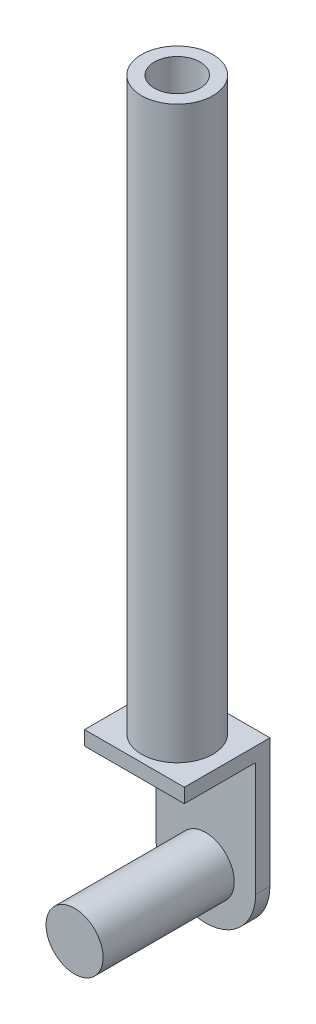
ISO-10303-21;
HEADER;
FILE_DESCRIPTION(('STEP AP214'),'2;1');
FILE_NAME('part.step','',(''),(''),'','','');
FILE_SCHEMA(('AUTOMOTIVE_DESIGN { 1 0 10303 214 1 1 1 1 }'));
ENDSEC;
DATA;
#1=APPLICATION_CONTEXT('core data for automotive mechanical design processes');
#2=APPLICATION_PROTOCOL_DEFINITION('international standard','automotive_design',2000,#1);
#3=PRODUCT_CONTEXT('',#1,'mechanical');
#4=PRODUCT('Part','Part','',(#3));
#5=PRODUCT_RELATED_PRODUCT_CATEGORY('part','',(#4));
#6=PRODUCT_DEFINITION_FORMATION('','',#4);
#7=PRODUCT_DEFINITION_CONTEXT('part definition',#1,'design');
#8=PRODUCT_DEFINITION('design','',#6,#7);
#9=PRODUCT_DEFINITION_SHAPE('','',#8);
#10=(LENGTH_UNIT() NAMED_UNIT(*) SI_UNIT(.MILLI.,.METRE.));
#11=(NAMED_UNIT(*) PLANE_ANGLE_UNIT() SI_UNIT($,.RADIAN.));
#12=(NAMED_UNIT(*) SI_UNIT($,.STERADIAN.) SOLID_ANGLE_UNIT());
#13=UNCERTAINTY_MEASURE_WITH_UNIT(LENGTH_MEASURE(1.E-05),#10,'distance_accuracy_value','');
#14=(GEOMETRIC_REPRESENTATION_CONTEXT(3) GLOBAL_UNCERTAINTY_ASSIGNED_CONTEXT((#13)) GLOBAL_UNIT_ASSIGNED_CONTEXT((#10,
#11,#12)) REPRESENTATION_CONTEXT('',''));
#15=CARTESIAN_POINT('',(0.,0.,0.));
#16=DIRECTION('',(0.,0.,1.));
#17=DIRECTION('',(1.,0.,0.));
#18=AXIS2_PLACEMENT_3D('',#15,#16,#17);
#19=CARTESIAN_POINT('',(0.,0.,5.));
#20=DIRECTION('',(0.,0.,-1.));
#21=DIRECTION('',(-1.,0.,0.));
#22=AXIS2_PLACEMENT_3D('',#19,#20,#21);
#23=CYLINDRICAL_SURFACE('',#22,17.5);
#24=CARTESIAN_POINT('',(0.,0.,0.));
#25=DIRECTION('',(0.,0.,1.));
#26=DIRECTION('',(1.,0.,0.));
#27=AXIS2_PLACEMENT_3D('',#24,#25,#26);
#28=CIRCLE('',#27,17.5);
#29=CARTESIAN_POINT('',(-17.5,0.,0.));
#30=VERTEX_POINT('',#29);
#31=CARTESIAN_POINT('',(17.5,0.,0.));
#32=VERTEX_POINT('',#31);
#33=EDGE_CURVE('E109',#30,#32,#28,.T.);
#34=ORIENTED_EDGE('',*,*,#33,.T.);
#35=DIRECTION('',(0.,0.,-1.));
#36=VECTOR('',#35,1.);
#37=CARTESIAN_POINT('',(17.5,0.,5.));
#38=LINE('',#37,#36);
#39=CARTESIAN_POINT('',(17.5,0.,5.));
#40=VERTEX_POINT('',#39);
#41=EDGE_CURVE('E95',#40,#32,#38,.T.);
#42=ORIENTED_EDGE('',*,*,#41,.F.);
#43=CARTESIAN_POINT('',(0.,0.,5.));
#44=DIRECTION('',(0.,0.,1.));
#45=DIRECTION('',(1.,0.,0.));
#46=AXIS2_PLACEMENT_3D('',#43,#44,#45);
#47=CIRCLE('',#46,17.5);
#48=CARTESIAN_POINT('',(-17.5,0.,5.));
#49=VERTEX_POINT('',#48);
#50=EDGE_CURVE('E100',#49,#40,#47,.T.);
#51=ORIENTED_EDGE('',*,*,#50,.F.);
#52=DIRECTION('',(0.,0.,-1.));
#53=VECTOR('',#52,1.);
#54=CARTESIAN_POINT('',(-17.5,0.,5.));
#55=LINE('',#54,#53);
#56=EDGE_CURVE('E111',#49,#30,#55,.T.);
#57=ORIENTED_EDGE('',*,*,#56,.T.);
#58=EDGE_LOOP('',(#34,#42,#51,#57));
#59=FACE_BOUND('',#58,.T.);
#60=ADVANCED_FACE('F43',(#59),#23,.T.);
#61=CARTESIAN_POINT('',(17.5,40.,5.));
#62=DIRECTION('',(-1.,0.,0.));
#63=DIRECTION('',(0.,-1.,0.));
#64=AXIS2_PLACEMENT_3D('',#61,#62,#63);
#65=PLANE('',#64);
#66=DIRECTION('',(0.,1.,0.));
#67=VECTOR('',#66,1.);
#68=CARTESIAN_POINT('',(17.5,40.,0.));
#69=LINE('',#68,#67);
#70=CARTESIAN_POINT('',(17.5,45.,0.));
#71=VERTEX_POINT('',#70);
#72=EDGE_CURVE('E73',#32,#71,#69,.T.);
#73=ORIENTED_EDGE('',*,*,#72,.T.);
#74=DIRECTION('',(0.,0.,-1.));
#75=VECTOR('',#74,1.);
#76=CARTESIAN_POINT('',(17.5,45.,0.));
#77=LINE('',#76,#75);
#78=CARTESIAN_POINT('',(17.5,45.,30.));
#79=VERTEX_POINT('',#78);
#80=EDGE_CURVE('E155',#79,#71,#77,.T.);
#81=ORIENTED_EDGE('',*,*,#80,.F.);
#82=DIRECTION('',(0.,-1.,0.));
#83=VECTOR('',#82,1.);
#84=CARTESIAN_POINT('',(17.5,45.,30.));
#85=LINE('',#84,#83);
#86=CARTESIAN_POINT('',(17.5,40.,30.));
#87=VERTEX_POINT('',#86);
#88=EDGE_CURVE('E136',#79,#87,#85,.T.);
#89=ORIENTED_EDGE('',*,*,#88,.T.);
#90=DIRECTION('',(0.,0.,-1.));
#91=VECTOR('',#90,1.);
#92=CARTESIAN_POINT('',(17.5,40.,0.));
#93=LINE('',#92,#91);
#94=CARTESIAN_POINT('',(17.5,40.,5.));
#95=VERTEX_POINT('',#94);
#96=EDGE_CURVE('E98',#87,#95,#93,.T.);
#97=ORIENTED_EDGE('',*,*,#96,.T.);
#98=DIRECTION('',(0.,1.,0.));
#99=VECTOR('',#98,1.);
#100=CARTESIAN_POINT('',(17.5,40.,5.));
#101=LINE('',#100,#99);
#102=EDGE_CURVE('E92',#40,#95,#101,.T.);
#103=ORIENTED_EDGE('',*,*,#102,.F.);
#104=ORIENTED_EDGE('',*,*,#41,.T.);
#105=EDGE_LOOP('',(#73,#81,#89,#97,#103,#104));
#106=FACE_BOUND('',#105,.T.);
#107=ADVANCED_FACE('F93',(#106),#65,.F.);
#108=CARTESIAN_POINT('',(-17.5,0.,5.));
#109=DIRECTION('',(1.,0.,0.));
#110=DIRECTION('',(0.,1.,0.));
#111=AXIS2_PLACEMENT_3D('',#108,#109,#110);
#112=PLANE('',#111);
#113=DIRECTION('',(0.,-1.,0.));
#114=VECTOR('',#113,1.);
#115=CARTESIAN_POINT('',(-17.5,0.,0.));
#116=LINE('',#115,#114);
#117=CARTESIAN_POINT('',(-17.5,45.,0.));
#118=VERTEX_POINT('',#117);
#119=EDGE_CURVE('E107',#118,#30,#116,.T.);
#120=ORIENTED_EDGE('',*,*,#119,.T.);
#121=ORIENTED_EDGE('',*,*,#56,.F.);
#122=DIRECTION('',(0.,-1.,0.));
#123=VECTOR('',#122,1.);
#124=CARTESIAN_POINT('',(-17.5,0.,5.));
#125=LINE('',#124,#123);
#126=CARTESIAN_POINT('',(-17.5,40.,5.));
#127=VERTEX_POINT('',#126);
#128=EDGE_CURVE('E60',#127,#49,#125,.T.);
#129=ORIENTED_EDGE('',*,*,#128,.F.);
#130=DIRECTION('',(0.,0.,1.));
#131=VECTOR('',#130,1.);
#132=CARTESIAN_POINT('',(-17.5,40.,0.));
#133=LINE('',#132,#131);
#134=CARTESIAN_POINT('',(-17.5,40.,30.));
#135=VERTEX_POINT('',#134);
#136=EDGE_CURVE('E147',#127,#135,#133,.T.);
#137=ORIENTED_EDGE('',*,*,#136,.T.);
#138=DIRECTION('',(0.,-1.,0.));
#139=VECTOR('',#138,1.);
#140=CARTESIAN_POINT('',(-17.5,45.,30.));
#141=LINE('',#140,#139);
#142=CARTESIAN_POINT('',(-17.5,45.,30.));
#143=VERTEX_POINT('',#142);
#144=EDGE_CURVE('E132',#143,#135,#141,.T.);
#145=ORIENTED_EDGE('',*,*,#144,.F.);
#146=DIRECTION('',(0.,0.,1.));
#147=VECTOR('',#146,1.);
#148=CARTESIAN_POINT('',(-17.5,45.,0.));
#149=LINE('',#148,#147);
#150=EDGE_CURVE('E142',#118,#143,#149,.T.);
#151=ORIENTED_EDGE('',*,*,#150,.F.);
#152=EDGE_LOOP('',(#120,#121,#129,#137,#145,#151));
#153=FACE_BOUND('',#152,.T.);
#154=ADVANCED_FACE('F202',(#153),#112,.F.);
#155=CARTESIAN_POINT('',(0.,0.,5.));
#156=DIRECTION('',(0.,0.,1.));
#157=DIRECTION('',(1.,0.,0.));
#158=AXIS2_PLACEMENT_3D('',#155,#156,#157);
#159=PLANE('',#158);
#160=CARTESIAN_POINT('',(0.,0.,5.));
#161=DIRECTION('',(0.,0.,1.));
#162=DIRECTION('',(1.,0.,0.));
#163=AXIS2_PLACEMENT_3D('',#160,#161,#162);
#164=CIRCLE('',#163,10.);
#165=CARTESIAN_POINT('',(10.,0.,5.));
#166=VERTEX_POINT('',#165);
#167=EDGE_CURVE('E52',#166,#166,#164,.T.);
#168=ORIENTED_EDGE('',*,*,#167,.F.);
#169=EDGE_LOOP('',(#168));
#170=FACE_BOUND('',#169,.T.);
#171=ORIENTED_EDGE('',*,*,#50,.T.);
#172=ORIENTED_EDGE('',*,*,#102,.T.);
#173=DIRECTION('',(-1.,0.,0.));
#174=VECTOR('',#173,1.);
#175=CARTESIAN_POINT('',(-17.5,40.,5.));
#176=LINE('',#175,#174);
#177=EDGE_CURVE('E81',#95,#127,#176,.T.);
#178=ORIENTED_EDGE('',*,*,#177,.T.);
#179=ORIENTED_EDGE('',*,*,#128,.T.);
#180=EDGE_LOOP('',(#171,#172,#178,#179));
#181=FACE_BOUND('',#180,.T.);
#182=ADVANCED_FACE('F103',(#170,#181),#159,.T.);
#183=CARTESIAN_POINT('',(0.,0.,0.));
#184=DIRECTION('',(0.,0.,1.));
#185=DIRECTION('',(1.,0.,0.));
#186=AXIS2_PLACEMENT_3D('',#183,#184,#185);
#187=PLANE('',#186);
#188=ORIENTED_EDGE('',*,*,#33,.F.);
#189=ORIENTED_EDGE('',*,*,#119,.F.);
#190=DIRECTION('',(-1.,0.,0.));
#191=VECTOR('',#190,1.);
#192=CARTESIAN_POINT('',(-17.5,45.,0.));
#193=LINE('',#192,#191);
#194=EDGE_CURVE('E139',#71,#118,#193,.T.);
#195=ORIENTED_EDGE('',*,*,#194,.F.);
#196=ORIENTED_EDGE('',*,*,#72,.F.);
#197=EDGE_LOOP('',(#188,#189,#195,#196));
#198=FACE_BOUND('',#197,.T.);
#199=ADVANCED_FACE('F210',(#198),#187,.F.);
#200=CARTESIAN_POINT('',(0.,0.,51.));
#201=DIRECTION('',(0.,0.,-1.));
#202=DIRECTION('',(-1.,0.,0.));
#203=AXIS2_PLACEMENT_3D('',#200,#201,#202);
#204=CYLINDRICAL_SURFACE('',#203,10.);
#205=CARTESIAN_POINT('',(0.,0.,51.));
#206=DIRECTION('',(0.,0.,1.));
#207=DIRECTION('',(1.,0.,0.));
#208=AXIS2_PLACEMENT_3D('',#205,#206,#207);
#209=CIRCLE('',#208,10.);
#210=CARTESIAN_POINT('',(10.,0.,51.));
#211=VERTEX_POINT('',#210);
#212=EDGE_CURVE('E124',#211,#211,#209,.T.);
#213=ORIENTED_EDGE('',*,*,#212,.F.);
#214=EDGE_LOOP('',(#213));
#215=FACE_BOUND('',#214,.T.);
#216=ORIENTED_EDGE('',*,*,#167,.T.);
#217=EDGE_LOOP('',(#216));
#218=FACE_BOUND('',#217,.T.);
#219=ADVANCED_FACE('F213',(#215,#218),#204,.T.);
#220=CARTESIAN_POINT('',(0.,0.,51.));
#221=DIRECTION('',(0.,0.,1.));
#222=DIRECTION('',(1.,0.,0.));
#223=AXIS2_PLACEMENT_3D('',#220,#221,#222);
#224=PLANE('',#223);
#225=ORIENTED_EDGE('',*,*,#212,.T.);
#226=EDGE_LOOP('',(#225));
#227=FACE_BOUND('',#226,.T.);
#228=ADVANCED_FACE('F218',(#227),#224,.T.);
#229=CARTESIAN_POINT('',(-17.5,45.,30.));
#230=DIRECTION('',(0.,0.,-1.));
#231=DIRECTION('',(-1.,0.,0.));
#232=AXIS2_PLACEMENT_3D('',#229,#230,#231);
#233=PLANE('',#232);
#234=DIRECTION('',(1.,0.,0.));
#235=VECTOR('',#234,1.);
#236=CARTESIAN_POINT('',(-17.5,40.,30.));
#237=LINE('',#236,#235);
#238=EDGE_CURVE('E143',#135,#87,#237,.T.);
#239=ORIENTED_EDGE('',*,*,#238,.T.);
#240=ORIENTED_EDGE('',*,*,#88,.F.);
#241=DIRECTION('',(1.,0.,0.));
#242=VECTOR('',#241,1.);
#243=CARTESIAN_POINT('',(-17.5,45.,30.));
#244=LINE('',#243,#242);
#245=EDGE_CURVE('E159',#143,#79,#244,.T.);
#246=ORIENTED_EDGE('',*,*,#245,.F.);
#247=ORIENTED_EDGE('',*,*,#144,.T.);
#248=EDGE_LOOP('',(#239,#240,#246,#247));
#249=FACE_BOUND('',#248,.T.);
#250=ADVANCED_FACE('F221',(#249),#233,.F.);
#251=CARTESIAN_POINT('',(0.,45.,0.));
#252=DIRECTION('',(0.,1.,0.));
#253=DIRECTION('',(0.,0.,1.));
#254=AXIS2_PLACEMENT_3D('',#251,#252,#253);
#255=PLANE('',#254);
#256=CARTESIAN_POINT('',(0.,45.,15.));
#257=DIRECTION('',(0.,1.,0.));
#258=DIRECTION('',(0.,0.,1.));
#259=AXIS2_PLACEMENT_3D('',#256,#257,#258);
#260=CIRCLE('',#259,12.5);
#261=CARTESIAN_POINT('',(0.,45.,27.5));
#262=VERTEX_POINT('',#261);
#263=EDGE_CURVE('E166',#262,#262,#260,.T.);
#264=ORIENTED_EDGE('',*,*,#263,.F.);
#265=EDGE_LOOP('',(#264));
#266=FACE_BOUND('',#265,.T.);
#267=ORIENTED_EDGE('',*,*,#150,.T.);
#268=ORIENTED_EDGE('',*,*,#245,.T.);
#269=ORIENTED_EDGE('',*,*,#80,.T.);
#270=ORIENTED_EDGE('',*,*,#194,.T.);
#271=EDGE_LOOP('',(#267,#268,#269,#270));
#272=FACE_BOUND('',#271,.T.);
#273=ADVANCED_FACE('F194',(#266,#272),#255,.T.);
#274=CARTESIAN_POINT('',(0.,40.,0.));
#275=DIRECTION('',(0.,1.,0.));
#276=DIRECTION('',(0.,0.,1.));
#277=AXIS2_PLACEMENT_3D('',#274,#275,#276);
#278=PLANE('',#277);
#279=ORIENTED_EDGE('',*,*,#177,.F.);
#280=ORIENTED_EDGE('',*,*,#96,.F.);
#281=ORIENTED_EDGE('',*,*,#238,.F.);
#282=ORIENTED_EDGE('',*,*,#136,.F.);
#283=EDGE_LOOP('',(#279,#280,#281,#282));
#284=FACE_BOUND('',#283,.T.);
#285=ADVANCED_FACE('F184',(#284),#278,.F.);
#286=CARTESIAN_POINT('',(0.,245.,15.));
#287=DIRECTION('',(0.,1.,0.));
#288=DIRECTION('',(0.,0.,1.));
#289=AXIS2_PLACEMENT_3D('',#286,#287,#288);
#290=PLANE('',#289);
#291=CARTESIAN_POINT('',(0.,245.,15.));
#292=DIRECTION('',(0.,1.,0.));
#293=DIRECTION('',(0.,0.,1.));
#294=AXIS2_PLACEMENT_3D('',#291,#292,#293);
#295=CIRCLE('',#294,12.5);
#296=CARTESIAN_POINT('',(0.,245.,27.5));
#297=VERTEX_POINT('',#296);
#298=EDGE_CURVE('E151',#297,#297,#295,.T.);
#299=ORIENTED_EDGE('',*,*,#298,.T.);
#300=EDGE_LOOP('',(#299));
#301=FACE_BOUND('',#300,.T.);
#302=CARTESIAN_POINT('',(0.,245.,15.));
#303=DIRECTION('',(0.,1.,0.));
#304=DIRECTION('',(0.,0.,1.));
#305=AXIS2_PLACEMENT_3D('',#302,#303,#304);
#306=CIRCLE('',#305,8.);
#307=CARTESIAN_POINT('',(0.,245.,23.));
#308=VERTEX_POINT('',#307);
#309=EDGE_CURVE('E170',#308,#308,#306,.T.);
#310=ORIENTED_EDGE('',*,*,#309,.F.);
#311=EDGE_LOOP('',(#310));
#312=FACE_BOUND('',#311,.T.);
#313=ADVANCED_FACE('F181',(#301,#312),#290,.T.);
#314=CARTESIAN_POINT('',(0.,245.,15.));
#315=DIRECTION('',(0.,-1.,0.));
#316=DIRECTION('',(0.,0.,-1.));
#317=AXIS2_PLACEMENT_3D('',#314,#315,#316);
#318=CYLINDRICAL_SURFACE('',#317,12.5);
#319=ORIENTED_EDGE('',*,*,#298,.F.);
#320=EDGE_LOOP('',(#319));
#321=FACE_BOUND('',#320,.T.);
#322=ORIENTED_EDGE('',*,*,#263,.T.);
#323=EDGE_LOOP('',(#322));
#324=FACE_BOUND('',#323,.T.);
#325=ADVANCED_FACE('F183',(#321,#324),#318,.T.);
#326=CARTESIAN_POINT('',(0.,245.,15.));
#327=DIRECTION('',(0.,-1.,0.));
#328=DIRECTION('',(0.,0.,-1.));
#329=AXIS2_PLACEMENT_3D('',#326,#327,#328);
#330=CYLINDRICAL_SURFACE('',#329,8.);
#331=ORIENTED_EDGE('',*,*,#309,.T.);
#332=EDGE_LOOP('',(#331));
#333=FACE_BOUND('',#332,.T.);
#334=CARTESIAN_POINT('',(0.,45.,15.));
#335=DIRECTION('',(0.,1.,0.));
#336=DIRECTION('',(0.,0.,1.));
#337=AXIS2_PLACEMENT_3D('',#334,#335,#336);
#338=CIRCLE('',#337,8.);
#339=CARTESIAN_POINT('',(0.,45.,23.));
#340=VERTEX_POINT('',#339);
#341=EDGE_CURVE('E11',#340,#340,#338,.F.);
#342=ORIENTED_EDGE('',*,*,#341,.T.);
#343=EDGE_LOOP('',(#342));
#344=FACE_BOUND('',#343,.T.);
#345=ADVANCED_FACE('F178',(#333,#344),#330,.F.);
#346=ORIENTED_EDGE('',*,*,#341,.F.);
#347=EDGE_LOOP('',(#346));
#348=FACE_BOUND('',#347,.T.);
#349=ADVANCED_FACE('F227',(#348),#255,.T.);
#350=CLOSED_SHELL('',(#60,#107,#154,#182,#199,#219,#228,#250,#273,#285,#313,#325,#345,#349));
#351=MANIFOLD_SOLID_BREP('B2',#350);
#352=ADVANCED_BREP_SHAPE_REPRESENTATION('',(#18,#351),#14);
#353=SHAPE_DEFINITION_REPRESENTATION(#9,#352);
ENDSEC;
END-ISO-10303-21;
